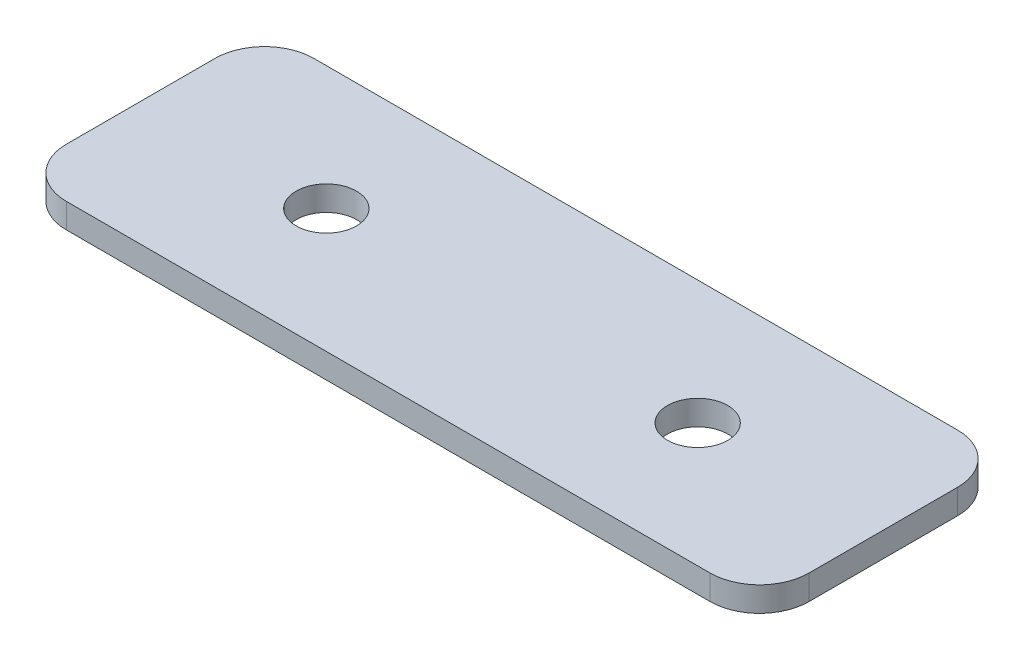
ISO-10303-21;
HEADER;
FILE_DESCRIPTION(('STEP AP214'),'2;1');
FILE_NAME('part.step','',(''),(''),'','','');
FILE_SCHEMA(('AUTOMOTIVE_DESIGN { 1 0 10303 214 1 1 1 1 }'));
ENDSEC;
DATA;
#1=APPLICATION_CONTEXT('core data for automotive mechanical design processes');
#2=APPLICATION_PROTOCOL_DEFINITION('international standard','automotive_design',2000,#1);
#3=PRODUCT_CONTEXT('',#1,'mechanical');
#4=PRODUCT('Part','Part','',(#3));
#5=PRODUCT_RELATED_PRODUCT_CATEGORY('part','',(#4));
#6=PRODUCT_DEFINITION_FORMATION('','',#4);
#7=PRODUCT_DEFINITION_CONTEXT('part definition',#1,'design');
#8=PRODUCT_DEFINITION('design','',#6,#7);
#9=PRODUCT_DEFINITION_SHAPE('','',#8);
#10=(LENGTH_UNIT() NAMED_UNIT(*) SI_UNIT(.MILLI.,.METRE.));
#11=(NAMED_UNIT(*) PLANE_ANGLE_UNIT() SI_UNIT($,.RADIAN.));
#12=(NAMED_UNIT(*) SI_UNIT($,.STERADIAN.) SOLID_ANGLE_UNIT());
#13=UNCERTAINTY_MEASURE_WITH_UNIT(LENGTH_MEASURE(1.E-05),#10,'distance_accuracy_value','');
#14=(GEOMETRIC_REPRESENTATION_CONTEXT(3) GLOBAL_UNCERTAINTY_ASSIGNED_CONTEXT((#13)) GLOBAL_UNIT_ASSIGNED_CONTEXT((#10,
#11,#12)) REPRESENTATION_CONTEXT('',''));
#15=CARTESIAN_POINT('',(0.,0.,0.));
#16=DIRECTION('',(0.,0.,1.));
#17=DIRECTION('',(1.,0.,0.));
#18=AXIS2_PLACEMENT_3D('',#15,#16,#17);
#19=CARTESIAN_POINT('',(0.,1.,0.));
#20=DIRECTION('',(0.,1.,0.));
#21=DIRECTION('',(0.,0.,1.));
#22=AXIS2_PLACEMENT_3D('',#19,#20,#21);
#23=PLANE('',#22);
#24=CARTESIAN_POINT('',(7.5,1.,0.));
#25=DIRECTION('',(0.,1.,0.));
#26=DIRECTION('',(0.,0.,1.));
#27=AXIS2_PLACEMENT_3D('',#24,#25,#26);
#28=CIRCLE('',#27,1.2192);
#29=CARTESIAN_POINT('',(7.5,1.,1.2192));
#30=VERTEX_POINT('',#29);
#31=EDGE_CURVE('E126',#30,#30,#28,.T.);
#32=ORIENTED_EDGE('',*,*,#31,.F.);
#33=EDGE_LOOP('',(#32));
#34=FACE_BOUND('',#33,.T.);
#35=DIRECTION('',(-1.,0.,0.));
#36=VECTOR('',#35,1.);
#37=CARTESIAN_POINT('',(15.,1.,-4.99999999999999));
#38=LINE('',#37,#36);
#39=CARTESIAN_POINT('',(13.,1.,-4.99999999999999));
#40=VERTEX_POINT('',#39);
#41=CARTESIAN_POINT('',(-13.,1.,-4.99999999999999));
#42=VERTEX_POINT('',#41);
#43=EDGE_CURVE('E135',#40,#42,#38,.T.);
#44=ORIENTED_EDGE('',*,*,#43,.T.);
#45=CARTESIAN_POINT('',(-13.,1.,-2.99999999999999));
#46=DIRECTION('',(0.,1.,0.));
#47=DIRECTION('',(0.,0.,1.));
#48=AXIS2_PLACEMENT_3D('',#45,#46,#47);
#49=CIRCLE('',#48,2.);
#50=CARTESIAN_POINT('',(-15.,1.,-2.99999999999999));
#51=VERTEX_POINT('',#50);
#52=EDGE_CURVE('E154',#42,#51,#49,.T.);
#53=ORIENTED_EDGE('',*,*,#52,.T.);
#54=DIRECTION('',(0.,0.,1.));
#55=VECTOR('',#54,1.);
#56=CARTESIAN_POINT('',(-15.,1.,-4.99999999999999));
#57=LINE('',#56,#55);
#58=CARTESIAN_POINT('',(-15.,1.,3.00000000000001));
#59=VERTEX_POINT('',#58);
#60=EDGE_CURVE('E118',#51,#59,#57,.T.);
#61=ORIENTED_EDGE('',*,*,#60,.T.);
#62=CARTESIAN_POINT('',(-13.,1.,3.00000000000001));
#63=DIRECTION('',(0.,1.,0.));
#64=DIRECTION('',(0.,0.,1.));
#65=AXIS2_PLACEMENT_3D('',#62,#63,#64);
#66=CIRCLE('',#65,2.);
#67=CARTESIAN_POINT('',(-13.,1.,5.00000000000001));
#68=VERTEX_POINT('',#67);
#69=EDGE_CURVE('E152',#59,#68,#66,.T.);
#70=ORIENTED_EDGE('',*,*,#69,.T.);
#71=DIRECTION('',(1.,0.,0.));
#72=VECTOR('',#71,1.);
#73=CARTESIAN_POINT('',(-15.,1.,5.00000000000001));
#74=LINE('',#73,#72);
#75=CARTESIAN_POINT('',(13.,1.,5.00000000000001));
#76=VERTEX_POINT('',#75);
#77=EDGE_CURVE('E174',#68,#76,#74,.T.);
#78=ORIENTED_EDGE('',*,*,#77,.T.);
#79=CARTESIAN_POINT('',(13.,1.,3.00000000000001));
#80=DIRECTION('',(0.,1.,0.));
#81=DIRECTION('',(0.,0.,1.));
#82=AXIS2_PLACEMENT_3D('',#79,#80,#81);
#83=CIRCLE('',#82,2.);
#84=CARTESIAN_POINT('',(15.,1.,3.00000000000001));
#85=VERTEX_POINT('',#84);
#86=EDGE_CURVE('E53',#76,#85,#83,.T.);
#87=ORIENTED_EDGE('',*,*,#86,.T.);
#88=DIRECTION('',(0.,0.,-1.));
#89=VECTOR('',#88,1.);
#90=CARTESIAN_POINT('',(15.,1.,5.00000000000001));
#91=LINE('',#90,#89);
#92=CARTESIAN_POINT('',(15.,1.,-2.99999999999999));
#93=VERTEX_POINT('',#92);
#94=EDGE_CURVE('E164',#85,#93,#91,.T.);
#95=ORIENTED_EDGE('',*,*,#94,.T.);
#96=CARTESIAN_POINT('',(13.,1.,-2.99999999999999));
#97=DIRECTION('',(0.,1.,0.));
#98=DIRECTION('',(0.,0.,1.));
#99=AXIS2_PLACEMENT_3D('',#96,#97,#98);
#100=CIRCLE('',#99,2.);
#101=EDGE_CURVE('E150',#93,#40,#100,.T.);
#102=ORIENTED_EDGE('',*,*,#101,.T.);
#103=EDGE_LOOP('',(#44,#53,#61,#70,#78,#87,#95,#102));
#104=FACE_BOUND('',#103,.T.);
#105=CARTESIAN_POINT('',(-7.5,1.,0.));
#106=DIRECTION('',(0.,1.,0.));
#107=DIRECTION('',(0.,0.,1.));
#108=AXIS2_PLACEMENT_3D('',#105,#106,#107);
#109=CIRCLE('',#108,1.2192);
#110=CARTESIAN_POINT('',(-7.5,1.,1.2192));
#111=VERTEX_POINT('',#110);
#112=EDGE_CURVE('E179',#111,#111,#109,.T.);
#113=ORIENTED_EDGE('',*,*,#112,.F.);
#114=EDGE_LOOP('',(#113));
#115=FACE_BOUND('',#114,.T.);
#116=ADVANCED_FACE('F33',(#34,#104,#115),#23,.T.);
#117=CARTESIAN_POINT('',(0.,0.,0.));
#118=DIRECTION('',(0.,1.,0.));
#119=DIRECTION('',(0.,0.,1.));
#120=AXIS2_PLACEMENT_3D('',#117,#118,#119);
#121=PLANE('',#120);
#122=DIRECTION('',(0.,0.,1.));
#123=VECTOR('',#122,1.);
#124=CARTESIAN_POINT('',(-15.,0.,-4.99999999999999));
#125=LINE('',#124,#123);
#126=CARTESIAN_POINT('',(-15.,0.,-2.99999999999999));
#127=VERTEX_POINT('',#126);
#128=CARTESIAN_POINT('',(-15.,0.,3.00000000000001));
#129=VERTEX_POINT('',#128);
#130=EDGE_CURVE('E115',#127,#129,#125,.T.);
#131=ORIENTED_EDGE('',*,*,#130,.F.);
#132=CARTESIAN_POINT('',(-13.,0.,-2.99999999999999));
#133=DIRECTION('',(0.,1.,0.));
#134=DIRECTION('',(0.,0.,1.));
#135=AXIS2_PLACEMENT_3D('',#132,#133,#134);
#136=CIRCLE('',#135,2.);
#137=CARTESIAN_POINT('',(-13.,0.,-4.99999999999999));
#138=VERTEX_POINT('',#137);
#139=EDGE_CURVE('E98',#127,#138,#136,.F.);
#140=ORIENTED_EDGE('',*,*,#139,.T.);
#141=DIRECTION('',(-1.,0.,0.));
#142=VECTOR('',#141,1.);
#143=CARTESIAN_POINT('',(15.,0.,-4.99999999999999));
#144=LINE('',#143,#142);
#145=CARTESIAN_POINT('',(13.,0.,-4.99999999999999));
#146=VERTEX_POINT('',#145);
#147=EDGE_CURVE('E139',#146,#138,#144,.T.);
#148=ORIENTED_EDGE('',*,*,#147,.F.);
#149=CARTESIAN_POINT('',(13.,0.,-2.99999999999999));
#150=DIRECTION('',(0.,1.,0.));
#151=DIRECTION('',(0.,0.,1.));
#152=AXIS2_PLACEMENT_3D('',#149,#150,#151);
#153=CIRCLE('',#152,2.);
#154=CARTESIAN_POINT('',(15.,0.,-2.99999999999999));
#155=VERTEX_POINT('',#154);
#156=EDGE_CURVE('E143',#146,#155,#153,.F.);
#157=ORIENTED_EDGE('',*,*,#156,.T.);
#158=DIRECTION('',(0.,0.,-1.));
#159=VECTOR('',#158,1.);
#160=CARTESIAN_POINT('',(15.,0.,5.00000000000001));
#161=LINE('',#160,#159);
#162=CARTESIAN_POINT('',(15.,0.,3.00000000000001));
#163=VERTEX_POINT('',#162);
#164=EDGE_CURVE('E129',#163,#155,#161,.T.);
#165=ORIENTED_EDGE('',*,*,#164,.F.);
#166=CARTESIAN_POINT('',(13.,0.,3.00000000000001));
#167=DIRECTION('',(0.,1.,0.));
#168=DIRECTION('',(0.,0.,1.));
#169=AXIS2_PLACEMENT_3D('',#166,#167,#168);
#170=CIRCLE('',#169,2.);
#171=CARTESIAN_POINT('',(13.,0.,5.00000000000001));
#172=VERTEX_POINT('',#171);
#173=EDGE_CURVE('E119',#163,#172,#170,.F.);
#174=ORIENTED_EDGE('',*,*,#173,.T.);
#175=DIRECTION('',(1.,0.,0.));
#176=VECTOR('',#175,1.);
#177=CARTESIAN_POINT('',(-15.,0.,5.00000000000001));
#178=LINE('',#177,#176);
#179=CARTESIAN_POINT('',(-13.,0.,5.00000000000001));
#180=VERTEX_POINT('',#179);
#181=EDGE_CURVE('E125',#180,#172,#178,.T.);
#182=ORIENTED_EDGE('',*,*,#181,.F.);
#183=CARTESIAN_POINT('',(-13.,0.,3.00000000000001));
#184=DIRECTION('',(0.,1.,0.));
#185=DIRECTION('',(0.,0.,1.));
#186=AXIS2_PLACEMENT_3D('',#183,#184,#185);
#187=CIRCLE('',#186,2.);
#188=EDGE_CURVE('E109',#180,#129,#187,.F.);
#189=ORIENTED_EDGE('',*,*,#188,.T.);
#190=EDGE_LOOP('',(#131,#140,#148,#157,#165,#174,#182,#189));
#191=FACE_BOUND('',#190,.T.);
#192=CARTESIAN_POINT('',(7.5,0.,0.));
#193=DIRECTION('',(0.,1.,0.));
#194=DIRECTION('',(0.,0.,1.));
#195=AXIS2_PLACEMENT_3D('',#192,#193,#194);
#196=CIRCLE('',#195,1.2192);
#197=CARTESIAN_POINT('',(7.5,0.,1.2192));
#198=VERTEX_POINT('',#197);
#199=EDGE_CURVE('E132',#198,#198,#196,.T.);
#200=ORIENTED_EDGE('',*,*,#199,.T.);
#201=EDGE_LOOP('',(#200));
#202=FACE_BOUND('',#201,.T.);
#203=CARTESIAN_POINT('',(-7.5,0.,0.));
#204=DIRECTION('',(0.,1.,0.));
#205=DIRECTION('',(0.,0.,1.));
#206=AXIS2_PLACEMENT_3D('',#203,#204,#205);
#207=CIRCLE('',#206,1.2192);
#208=CARTESIAN_POINT('',(-7.5,0.,1.2192));
#209=VERTEX_POINT('',#208);
#210=EDGE_CURVE('E181',#209,#209,#207,.T.);
#211=ORIENTED_EDGE('',*,*,#210,.T.);
#212=EDGE_LOOP('',(#211));
#213=FACE_BOUND('',#212,.T.);
#214=ADVANCED_FACE('F122',(#191,#202,#213),#121,.F.);
#215=CARTESIAN_POINT('',(-15.,1.,-4.99999999999999));
#216=DIRECTION('',(1.,0.,0.));
#217=DIRECTION('',(0.,0.,-1.));
#218=AXIS2_PLACEMENT_3D('',#215,#216,#217);
#219=PLANE('',#218);
#220=ORIENTED_EDGE('',*,*,#60,.F.);
#221=DIRECTION('',(0.,-1.,0.));
#222=VECTOR('',#221,1.);
#223=CARTESIAN_POINT('',(-15.,1.,-2.99999999999999));
#224=LINE('',#223,#222);
#225=EDGE_CURVE('E102',#51,#127,#224,.T.);
#226=ORIENTED_EDGE('',*,*,#225,.T.);
#227=ORIENTED_EDGE('',*,*,#130,.T.);
#228=DIRECTION('',(0.,-1.,0.));
#229=VECTOR('',#228,1.);
#230=CARTESIAN_POINT('',(-15.,1.,3.00000000000001));
#231=LINE('',#230,#229);
#232=EDGE_CURVE('E120',#129,#59,#231,.F.);
#233=ORIENTED_EDGE('',*,*,#232,.T.);
#234=EDGE_LOOP('',(#220,#226,#227,#233));
#235=FACE_BOUND('',#234,.T.);
#236=ADVANCED_FACE('F114',(#235),#219,.F.);
#237=CARTESIAN_POINT('',(-15.,1.,5.00000000000001));
#238=DIRECTION('',(0.,0.,-1.));
#239=DIRECTION('',(-1.,0.,0.));
#240=AXIS2_PLACEMENT_3D('',#237,#238,#239);
#241=PLANE('',#240);
#242=ORIENTED_EDGE('',*,*,#77,.F.);
#243=DIRECTION('',(0.,-1.,0.));
#244=VECTOR('',#243,1.);
#245=CARTESIAN_POINT('',(-13.,1.,5.00000000000001));
#246=LINE('',#245,#244);
#247=EDGE_CURVE('E158',#68,#180,#246,.T.);
#248=ORIENTED_EDGE('',*,*,#247,.T.);
#249=ORIENTED_EDGE('',*,*,#181,.T.);
#250=DIRECTION('',(0.,-1.,0.));
#251=VECTOR('',#250,1.);
#252=CARTESIAN_POINT('',(13.,1.,5.00000000000001));
#253=LINE('',#252,#251);
#254=EDGE_CURVE('E156',#172,#76,#253,.F.);
#255=ORIENTED_EDGE('',*,*,#254,.T.);
#256=EDGE_LOOP('',(#242,#248,#249,#255));
#257=FACE_BOUND('',#256,.T.);
#258=ADVANCED_FACE('F206',(#257),#241,.F.);
#259=CARTESIAN_POINT('',(15.,1.,5.00000000000001));
#260=DIRECTION('',(-1.,0.,0.));
#261=DIRECTION('',(0.,0.,1.));
#262=AXIS2_PLACEMENT_3D('',#259,#260,#261);
#263=PLANE('',#262);
#264=ORIENTED_EDGE('',*,*,#164,.T.);
#265=DIRECTION('',(0.,-1.,0.));
#266=VECTOR('',#265,1.);
#267=CARTESIAN_POINT('',(15.,1.,-2.99999999999999));
#268=LINE('',#267,#266);
#269=EDGE_CURVE('E11',#155,#93,#268,.F.);
#270=ORIENTED_EDGE('',*,*,#269,.T.);
#271=ORIENTED_EDGE('',*,*,#94,.F.);
#272=DIRECTION('',(0.,-1.,0.));
#273=VECTOR('',#272,1.);
#274=CARTESIAN_POINT('',(15.,1.,3.00000000000001));
#275=LINE('',#274,#273);
#276=EDGE_CURVE('E41',#85,#163,#275,.T.);
#277=ORIENTED_EDGE('',*,*,#276,.T.);
#278=EDGE_LOOP('',(#264,#270,#271,#277));
#279=FACE_BOUND('',#278,.T.);
#280=ADVANCED_FACE('F163',(#279),#263,.F.);
#281=CARTESIAN_POINT('',(15.,1.,-4.99999999999999));
#282=DIRECTION('',(0.,0.,1.));
#283=DIRECTION('',(1.,0.,0.));
#284=AXIS2_PLACEMENT_3D('',#281,#282,#283);
#285=PLANE('',#284);
#286=ORIENTED_EDGE('',*,*,#147,.T.);
#287=DIRECTION('',(0.,-1.,0.));
#288=VECTOR('',#287,1.);
#289=CARTESIAN_POINT('',(-13.,1.,-4.99999999999999));
#290=LINE('',#289,#288);
#291=EDGE_CURVE('E103',#138,#42,#290,.F.);
#292=ORIENTED_EDGE('',*,*,#291,.T.);
#293=ORIENTED_EDGE('',*,*,#43,.F.);
#294=DIRECTION('',(0.,-1.,0.));
#295=VECTOR('',#294,1.);
#296=CARTESIAN_POINT('',(13.,1.,-4.99999999999999));
#297=LINE('',#296,#295);
#298=EDGE_CURVE('E108',#40,#146,#297,.T.);
#299=ORIENTED_EDGE('',*,*,#298,.T.);
#300=EDGE_LOOP('',(#286,#292,#293,#299));
#301=FACE_BOUND('',#300,.T.);
#302=ADVANCED_FACE('F172',(#301),#285,.F.);
#303=CARTESIAN_POINT('',(7.5,1.,0.));
#304=DIRECTION('',(0.,-1.,0.));
#305=DIRECTION('',(0.,0.,-1.));
#306=AXIS2_PLACEMENT_3D('',#303,#304,#305);
#307=CYLINDRICAL_SURFACE('',#306,1.2192);
#308=ORIENTED_EDGE('',*,*,#31,.T.);
#309=EDGE_LOOP('',(#308));
#310=FACE_BOUND('',#309,.T.);
#311=ORIENTED_EDGE('',*,*,#199,.F.);
#312=EDGE_LOOP('',(#311));
#313=FACE_BOUND('',#312,.T.);
#314=ADVANCED_FACE('F199',(#310,#313),#307,.F.);
#315=CARTESIAN_POINT('',(-7.5,1.,0.));
#316=DIRECTION('',(0.,-1.,0.));
#317=DIRECTION('',(0.,0.,-1.));
#318=AXIS2_PLACEMENT_3D('',#315,#316,#317);
#319=CYLINDRICAL_SURFACE('',#318,1.2192);
#320=ORIENTED_EDGE('',*,*,#112,.T.);
#321=EDGE_LOOP('',(#320));
#322=FACE_BOUND('',#321,.T.);
#323=ORIENTED_EDGE('',*,*,#210,.F.);
#324=EDGE_LOOP('',(#323));
#325=FACE_BOUND('',#324,.T.);
#326=ADVANCED_FACE('F187',(#322,#325),#319,.F.);
#327=CARTESIAN_POINT('',(-13.,1.,-2.99999999999999));
#328=DIRECTION('',(0.,-1.,0.));
#329=DIRECTION('',(0.,0.,-1.));
#330=AXIS2_PLACEMENT_3D('',#327,#328,#329);
#331=CYLINDRICAL_SURFACE('',#330,2.);
#332=ORIENTED_EDGE('',*,*,#52,.F.);
#333=ORIENTED_EDGE('',*,*,#291,.F.);
#334=ORIENTED_EDGE('',*,*,#139,.F.);
#335=ORIENTED_EDGE('',*,*,#225,.F.);
#336=EDGE_LOOP('',(#332,#333,#334,#335));
#337=FACE_BOUND('',#336,.T.);
#338=ADVANCED_FACE('F101',(#337),#331,.T.);
#339=CARTESIAN_POINT('',(-13.,1.,3.00000000000001));
#340=DIRECTION('',(0.,-1.,0.));
#341=DIRECTION('',(0.,0.,-1.));
#342=AXIS2_PLACEMENT_3D('',#339,#340,#341);
#343=CYLINDRICAL_SURFACE('',#342,2.);
#344=ORIENTED_EDGE('',*,*,#69,.F.);
#345=ORIENTED_EDGE('',*,*,#232,.F.);
#346=ORIENTED_EDGE('',*,*,#188,.F.);
#347=ORIENTED_EDGE('',*,*,#247,.F.);
#348=EDGE_LOOP('',(#344,#345,#346,#347));
#349=FACE_BOUND('',#348,.T.);
#350=ADVANCED_FACE('F214',(#349),#343,.T.);
#351=CARTESIAN_POINT('',(13.,1.,-2.99999999999999));
#352=DIRECTION('',(0.,-1.,0.));
#353=DIRECTION('',(0.,0.,-1.));
#354=AXIS2_PLACEMENT_3D('',#351,#352,#353);
#355=CYLINDRICAL_SURFACE('',#354,2.);
#356=ORIENTED_EDGE('',*,*,#101,.F.);
#357=ORIENTED_EDGE('',*,*,#269,.F.);
#358=ORIENTED_EDGE('',*,*,#156,.F.);
#359=ORIENTED_EDGE('',*,*,#298,.F.);
#360=EDGE_LOOP('',(#356,#357,#358,#359));
#361=FACE_BOUND('',#360,.T.);
#362=ADVANCED_FACE('F169',(#361),#355,.T.);
#363=CARTESIAN_POINT('',(13.,1.,3.00000000000001));
#364=DIRECTION('',(0.,-1.,0.));
#365=DIRECTION('',(0.,0.,-1.));
#366=AXIS2_PLACEMENT_3D('',#363,#364,#365);
#367=CYLINDRICAL_SURFACE('',#366,2.);
#368=ORIENTED_EDGE('',*,*,#86,.F.);
#369=ORIENTED_EDGE('',*,*,#254,.F.);
#370=ORIENTED_EDGE('',*,*,#173,.F.);
#371=ORIENTED_EDGE('',*,*,#276,.F.);
#372=EDGE_LOOP('',(#368,#369,#370,#371));
#373=FACE_BOUND('',#372,.T.);
#374=ADVANCED_FACE('F35',(#373),#367,.T.);
#375=CLOSED_SHELL('',(#116,#214,#236,#258,#280,#302,#314,#326,#338,#350,#362,#374));
#376=MANIFOLD_SOLID_BREP('B2',#375);
#377=ADVANCED_BREP_SHAPE_REPRESENTATION('',(#18,#376),#14);
#378=SHAPE_DEFINITION_REPRESENTATION(#9,#377);
ENDSEC;
END-ISO-10303-21;
